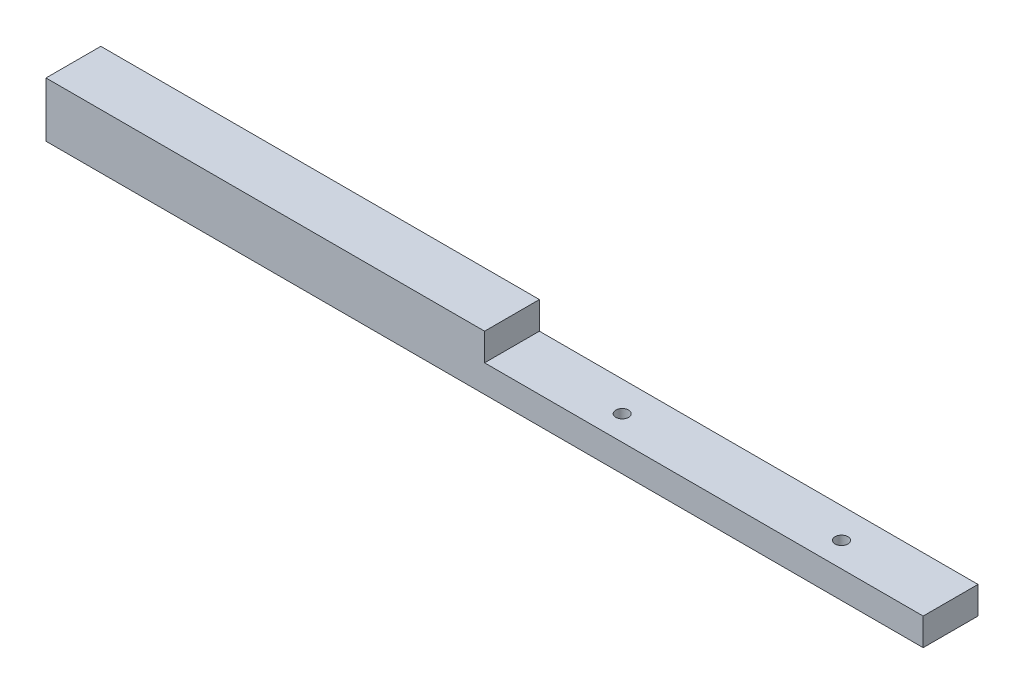
ISO-10303-21;
HEADER;
FILE_DESCRIPTION(('STEP AP214'),'2;1');
FILE_NAME('part.step','',(''),(''),'','','');
FILE_SCHEMA(('AUTOMOTIVE_DESIGN { 1 0 10303 214 1 1 1 1 }'));
ENDSEC;
DATA;
#1=APPLICATION_CONTEXT('core data for automotive mechanical design processes');
#2=APPLICATION_PROTOCOL_DEFINITION('international standard','automotive_design',2000,#1);
#3=PRODUCT_CONTEXT('',#1,'mechanical');
#4=PRODUCT('Part','Part','',(#3));
#5=PRODUCT_RELATED_PRODUCT_CATEGORY('part','',(#4));
#6=PRODUCT_DEFINITION_FORMATION('','',#4);
#7=PRODUCT_DEFINITION_CONTEXT('part definition',#1,'design');
#8=PRODUCT_DEFINITION('design','',#6,#7);
#9=PRODUCT_DEFINITION_SHAPE('','',#8);
#10=(LENGTH_UNIT() NAMED_UNIT(*) SI_UNIT(.MILLI.,.METRE.));
#11=(NAMED_UNIT(*) PLANE_ANGLE_UNIT() SI_UNIT($,.RADIAN.));
#12=(NAMED_UNIT(*) SI_UNIT($,.STERADIAN.) SOLID_ANGLE_UNIT());
#13=UNCERTAINTY_MEASURE_WITH_UNIT(LENGTH_MEASURE(1.E-05),#10,'distance_accuracy_value','');
#14=(GEOMETRIC_REPRESENTATION_CONTEXT(3) GLOBAL_UNCERTAINTY_ASSIGNED_CONTEXT((#13)) GLOBAL_UNIT_ASSIGNED_CONTEXT((#10,
#11,#12)) REPRESENTATION_CONTEXT('',''));
#15=CARTESIAN_POINT('',(0.,0.,0.));
#16=DIRECTION('',(0.,0.,1.));
#17=DIRECTION('',(1.,0.,0.));
#18=AXIS2_PLACEMENT_3D('',#15,#16,#17);
#19=CARTESIAN_POINT('',(195.886266753297,-328.191488077078,30.6295855642618));
#20=DIRECTION('',(0.,1.,0.));
#21=DIRECTION('',(0.,0.,1.));
#22=AXIS2_PLACEMENT_3D('',#19,#20,#21);
#23=CYLINDRICAL_SURFACE('',#22,1.75000000000001);
#24=CARTESIAN_POINT('',(195.886266753297,92.5,30.6295855642618));
#25=DIRECTION('',(0.,-1.,0.));
#26=DIRECTION('',(0.,0.,-1.));
#27=AXIS2_PLACEMENT_3D('',#24,#25,#26);
#28=CIRCLE('',#27,1.75000000000001);
#29=CARTESIAN_POINT('',(195.886266753297,92.5,28.8795855642618));
#30=VERTEX_POINT('',#29);
#31=EDGE_CURVE('E241',#30,#30,#28,.T.);
#32=ORIENTED_EDGE('',*,*,#31,.F.);
#33=EDGE_LOOP('',(#32));
#34=FACE_BOUND('',#33,.T.);
#35=CARTESIAN_POINT('',(195.886266753297,88.,30.6295855642618));
#36=DIRECTION('',(0.,-1.,0.));
#37=DIRECTION('',(0.,0.,-1.));
#38=AXIS2_PLACEMENT_3D('',#35,#36,#37);
#39=CIRCLE('',#38,1.75000000000001);
#40=CARTESIAN_POINT('',(195.886266753297,88.,28.8795855642618));
#41=VERTEX_POINT('',#40);
#42=EDGE_CURVE('E43',#41,#41,#39,.F.);
#43=ORIENTED_EDGE('',*,*,#42,.F.);
#44=EDGE_LOOP('',(#43));
#45=FACE_BOUND('',#44,.T.);
#46=ADVANCED_FACE('F39',(#34,#45),#23,.F.);
#47=CARTESIAN_POINT('',(135.886266753297,-328.191488077078,30.6295855642618));
#48=DIRECTION('',(0.,1.,0.));
#49=DIRECTION('',(0.,0.,1.));
#50=AXIS2_PLACEMENT_3D('',#47,#48,#49);
#51=CYLINDRICAL_SURFACE('',#50,1.75000000000001);
#52=CARTESIAN_POINT('',(135.886266753297,92.5,30.6295855642618));
#53=DIRECTION('',(0.,-1.,0.));
#54=DIRECTION('',(0.,0.,-1.));
#55=AXIS2_PLACEMENT_3D('',#52,#53,#54);
#56=CIRCLE('',#55,1.75000000000001);
#57=CARTESIAN_POINT('',(135.886266753297,92.5,28.8795855642618));
#58=VERTEX_POINT('',#57);
#59=EDGE_CURVE('E310',#58,#58,#56,.T.);
#60=ORIENTED_EDGE('',*,*,#59,.F.);
#61=EDGE_LOOP('',(#60));
#62=FACE_BOUND('',#61,.T.);
#63=CARTESIAN_POINT('',(135.886266753297,88.,30.6295855642618));
#64=DIRECTION('',(0.,-1.,0.));
#65=DIRECTION('',(0.,0.,-1.));
#66=AXIS2_PLACEMENT_3D('',#63,#64,#65);
#67=CIRCLE('',#66,1.75000000000001);
#68=CARTESIAN_POINT('',(135.886266753297,88.,28.8795855642618));
#69=VERTEX_POINT('',#68);
#70=EDGE_CURVE('E295',#69,#69,#67,.F.);
#71=ORIENTED_EDGE('',*,*,#70,.F.);
#72=EDGE_LOOP('',(#71));
#73=FACE_BOUND('',#72,.T.);
#74=ADVANCED_FACE('F382',(#62,#73),#51,.F.);
#75=CARTESIAN_POINT('',(225.,92.5,22.39));
#76=DIRECTION('',(-1.,0.,0.));
#77=DIRECTION('',(0.,0.,1.));
#78=AXIS2_PLACEMENT_3D('',#75,#76,#77);
#79=PLANE('',#78);
#80=DIRECTION('',(0.,0.,1.));
#81=VECTOR('',#80,1.);
#82=CARTESIAN_POINT('',(225.,92.5,22.39));
#83=LINE('',#82,#81);
#84=CARTESIAN_POINT('',(225.,92.5,22.4));
#85=VERTEX_POINT('',#84);
#86=CARTESIAN_POINT('',(225.,92.5,37.4));
#87=VERTEX_POINT('',#86);
#88=EDGE_CURVE('E11',#85,#87,#83,.T.);
#89=ORIENTED_EDGE('',*,*,#88,.T.);
#90=DIRECTION('',(0.,1.,0.));
#91=VECTOR('',#90,1.);
#92=CARTESIAN_POINT('',(225.,85.,37.4));
#93=LINE('',#92,#91);
#94=CARTESIAN_POINT('',(225.,85.,37.4));
#95=VERTEX_POINT('',#94);
#96=EDGE_CURVE('E360',#95,#87,#93,.T.);
#97=ORIENTED_EDGE('',*,*,#96,.F.);
#98=DIRECTION('',(0.,0.,1.));
#99=VECTOR('',#98,1.);
#100=CARTESIAN_POINT('',(225.,85.,22.4));
#101=LINE('',#100,#99);
#102=CARTESIAN_POINT('',(225.,85.,22.4));
#103=VERTEX_POINT('',#102);
#104=EDGE_CURVE('E357',#103,#95,#101,.T.);
#105=ORIENTED_EDGE('',*,*,#104,.F.);
#106=DIRECTION('',(0.,-1.,0.));
#107=VECTOR('',#106,1.);
#108=CARTESIAN_POINT('',(225.,85.,22.4));
#109=LINE('',#108,#107);
#110=EDGE_CURVE('E328',#85,#103,#109,.T.);
#111=ORIENTED_EDGE('',*,*,#110,.F.);
#112=EDGE_LOOP('',(#89,#97,#105,#111));
#113=FACE_BOUND('',#112,.T.);
#114=ADVANCED_FACE('F384',(#113),#79,.F.);
#115=CARTESIAN_POINT('',(105.,92.5,22.39));
#116=DIRECTION('',(0.,-1.,0.));
#117=DIRECTION('',(0.,0.,-1.));
#118=AXIS2_PLACEMENT_3D('',#115,#116,#117);
#119=PLANE('',#118);
#120=ORIENTED_EDGE('',*,*,#31,.T.);
#121=EDGE_LOOP('',(#120));
#122=FACE_BOUND('',#121,.T.);
#123=ORIENTED_EDGE('',*,*,#59,.T.);
#124=EDGE_LOOP('',(#123));
#125=FACE_BOUND('',#124,.T.);
#126=DIRECTION('',(0.,0.,1.));
#127=VECTOR('',#126,1.);
#128=CARTESIAN_POINT('',(105.,92.5,22.39));
#129=LINE('',#128,#127);
#130=CARTESIAN_POINT('',(105.,92.5,22.4));
#131=VERTEX_POINT('',#130);
#132=CARTESIAN_POINT('',(105.,92.5,37.4));
#133=VERTEX_POINT('',#132);
#134=EDGE_CURVE('E49',#131,#133,#129,.T.);
#135=ORIENTED_EDGE('',*,*,#134,.T.);
#136=DIRECTION('',(-1.,0.,0.));
#137=VECTOR('',#136,1.);
#138=CARTESIAN_POINT('',(-36.2132034355964,92.5,37.4));
#139=LINE('',#138,#137);
#140=EDGE_CURVE('E363',#87,#133,#139,.T.);
#141=ORIENTED_EDGE('',*,*,#140,.F.);
#142=ORIENTED_EDGE('',*,*,#88,.F.);
#143=DIRECTION('',(1.,0.,0.));
#144=VECTOR('',#143,1.);
#145=CARTESIAN_POINT('',(-36.2132034355964,92.5,22.4));
#146=LINE('',#145,#144);
#147=EDGE_CURVE('E349',#131,#85,#146,.T.);
#148=ORIENTED_EDGE('',*,*,#147,.F.);
#149=EDGE_LOOP('',(#135,#141,#142,#148));
#150=FACE_BOUND('',#149,.T.);
#151=ADVANCED_FACE('F391',(#122,#125,#150),#119,.F.);
#152=CARTESIAN_POINT('',(105.,100.,22.39));
#153=DIRECTION('',(-1.,0.,0.));
#154=DIRECTION('',(0.,0.,1.));
#155=AXIS2_PLACEMENT_3D('',#152,#153,#154);
#156=PLANE('',#155);
#157=DIRECTION('',(0.,0.,-1.));
#158=VECTOR('',#157,1.);
#159=CARTESIAN_POINT('',(105.,100.,22.4));
#160=LINE('',#159,#158);
#161=CARTESIAN_POINT('',(105.,100.,37.4));
#162=VERTEX_POINT('',#161);
#163=CARTESIAN_POINT('',(105.,100.,22.4));
#164=VERTEX_POINT('',#163);
#165=EDGE_CURVE('E369',#162,#164,#160,.T.);
#166=ORIENTED_EDGE('',*,*,#165,.F.);
#167=DIRECTION('',(0.,1.,0.));
#168=VECTOR('',#167,1.);
#169=CARTESIAN_POINT('',(105.,85.,37.4));
#170=LINE('',#169,#168);
#171=EDGE_CURVE('E366',#133,#162,#170,.T.);
#172=ORIENTED_EDGE('',*,*,#171,.F.);
#173=ORIENTED_EDGE('',*,*,#134,.F.);
#174=DIRECTION('',(0.,-1.,0.));
#175=VECTOR('',#174,1.);
#176=CARTESIAN_POINT('',(105.,85.,22.4));
#177=LINE('',#176,#175);
#178=EDGE_CURVE('E353',#164,#131,#177,.T.);
#179=ORIENTED_EDGE('',*,*,#178,.F.);
#180=EDGE_LOOP('',(#166,#172,#173,#179));
#181=FACE_BOUND('',#180,.T.);
#182=ADVANCED_FACE('F41',(#181),#156,.F.);
#183=CARTESIAN_POINT('',(-36.2132034355964,85.,37.4));
#184=DIRECTION('',(0.,0.,-1.));
#185=DIRECTION('',(-1.,0.,0.));
#186=AXIS2_PLACEMENT_3D('',#183,#184,#185);
#187=PLANE('',#186);
#188=ORIENTED_EDGE('',*,*,#140,.T.);
#189=ORIENTED_EDGE('',*,*,#171,.T.);
#190=DIRECTION('',(1.,0.,0.));
#191=VECTOR('',#190,1.);
#192=CARTESIAN_POINT('',(-36.2132034355964,100.,37.4));
#193=LINE('',#192,#191);
#194=CARTESIAN_POINT('',(-15.,100.,37.4));
#195=VERTEX_POINT('',#194);
#196=EDGE_CURVE('E332',#195,#162,#193,.T.);
#197=ORIENTED_EDGE('',*,*,#196,.F.);
#198=DIRECTION('',(0.,-1.,0.));
#199=VECTOR('',#198,1.);
#200=CARTESIAN_POINT('',(-15.,85.,37.4));
#201=LINE('',#200,#199);
#202=CARTESIAN_POINT('',(-15.,85.,37.4));
#203=VERTEX_POINT('',#202);
#204=EDGE_CURVE('E315',#195,#203,#201,.T.);
#205=ORIENTED_EDGE('',*,*,#204,.T.);
#206=DIRECTION('',(1.,0.,0.));
#207=VECTOR('',#206,1.);
#208=CARTESIAN_POINT('',(-36.2132034355964,85.,37.4));
#209=LINE('',#208,#207);
#210=EDGE_CURVE('E336',#203,#95,#209,.T.);
#211=ORIENTED_EDGE('',*,*,#210,.T.);
#212=ORIENTED_EDGE('',*,*,#96,.T.);
#213=EDGE_LOOP('',(#188,#189,#197,#205,#211,#212));
#214=FACE_BOUND('',#213,.T.);
#215=ADVANCED_FACE('F405',(#214),#187,.F.);
#216=CARTESIAN_POINT('',(-15.,85.,-158.613203435596));
#217=DIRECTION('',(1.,0.,0.));
#218=DIRECTION('',(0.,0.,-1.));
#219=AXIS2_PLACEMENT_3D('',#216,#217,#218);
#220=PLANE('',#219);
#221=DIRECTION('',(0.,0.,-1.));
#222=VECTOR('',#221,1.);
#223=CARTESIAN_POINT('',(-15.,85.,22.4));
#224=LINE('',#223,#222);
#225=CARTESIAN_POINT('',(-15.,85.,22.4));
#226=VERTEX_POINT('',#225);
#227=EDGE_CURVE('E319',#203,#226,#224,.T.);
#228=ORIENTED_EDGE('',*,*,#227,.F.);
#229=ORIENTED_EDGE('',*,*,#204,.F.);
#230=DIRECTION('',(0.,0.,1.));
#231=VECTOR('',#230,1.);
#232=CARTESIAN_POINT('',(-15.,100.,22.4));
#233=LINE('',#232,#231);
#234=CARTESIAN_POINT('',(-15.,100.,22.4));
#235=VERTEX_POINT('',#234);
#236=EDGE_CURVE('E320',#235,#195,#233,.T.);
#237=ORIENTED_EDGE('',*,*,#236,.F.);
#238=DIRECTION('',(0.,1.,0.));
#239=VECTOR('',#238,1.);
#240=CARTESIAN_POINT('',(-15.,85.,22.4));
#241=LINE('',#240,#239);
#242=EDGE_CURVE('E324',#226,#235,#241,.T.);
#243=ORIENTED_EDGE('',*,*,#242,.F.);
#244=EDGE_LOOP('',(#228,#229,#237,#243));
#245=FACE_BOUND('',#244,.T.);
#246=ADVANCED_FACE('F401',(#245),#220,.F.);
#247=CARTESIAN_POINT('',(-36.2132034355964,85.,22.4));
#248=DIRECTION('',(0.,1.,0.));
#249=DIRECTION('',(0.,0.,1.));
#250=AXIS2_PLACEMENT_3D('',#247,#248,#249);
#251=PLANE('',#250);
#252=DIRECTION('',(0.866025403784439,0.,0.499999999999999));
#253=VECTOR('',#252,1.);
#254=CARTESIAN_POINT('',(270.117714950395,85.,70.0230305480528));
#255=LINE('',#254,#253);
#256=CARTESIAN_POINT('',(195.886266753297,85.,27.1654839491226));
#257=VERTEX_POINT('',#256);
#258=CARTESIAN_POINT('',(198.886266753297,85.,28.8975347566915));
#259=VERTEX_POINT('',#258);
#260=EDGE_CURVE('E213',#257,#259,#255,.T.);
#261=ORIENTED_EDGE('',*,*,#260,.F.);
#262=DIRECTION('',(0.866025403784438,0.,-0.500000000000002));
#263=VECTOR('',#262,1.);
#264=CARTESIAN_POINT('',(399.645223579648,85.,-90.4748046243693));
#265=LINE('',#264,#263);
#266=CARTESIAN_POINT('',(192.886266753297,85.,28.8975347566915));
#267=VERTEX_POINT('',#266);
#268=EDGE_CURVE('E57',#267,#257,#265,.T.);
#269=ORIENTED_EDGE('',*,*,#268,.F.);
#270=DIRECTION('',(0.,0.,-1.));
#271=VECTOR('',#270,1.);
#272=CARTESIAN_POINT('',(192.886266753297,85.,-122.4));
#273=LINE('',#272,#271);
#274=CARTESIAN_POINT('',(192.886266753297,85.,32.3616363718292));
#275=VERTEX_POINT('',#274);
#276=EDGE_CURVE('E192',#275,#267,#273,.T.);
#277=ORIENTED_EDGE('',*,*,#276,.F.);
#278=DIRECTION('',(-0.866025403784439,0.,-0.5));
#279=VECTOR('',#278,1.);
#280=CARTESIAN_POINT('',(267.117714950395,85.,75.2191829707593));
#281=LINE('',#280,#279);
#282=CARTESIAN_POINT('',(195.886266753297,85.,34.0936871793981));
#283=VERTEX_POINT('',#282);
#284=EDGE_CURVE('E197',#283,#275,#281,.T.);
#285=ORIENTED_EDGE('',*,*,#284,.F.);
#286=DIRECTION('',(-0.866025403784439,0.,0.5));
#287=VECTOR('',#286,1.);
#288=CARTESIAN_POINT('',(402.645223579648,85.,-85.2786522016621));
#289=LINE('',#288,#287);
#290=CARTESIAN_POINT('',(198.886266753296,85.,32.3616363718296));
#291=VERTEX_POINT('',#290);
#292=EDGE_CURVE('E220',#291,#283,#289,.T.);
#293=ORIENTED_EDGE('',*,*,#292,.F.);
#294=DIRECTION('',(0.,0.,1.));
#295=VECTOR('',#294,1.);
#296=CARTESIAN_POINT('',(198.886266753297,85.,-122.4));
#297=LINE('',#296,#295);
#298=EDGE_CURVE('E216',#259,#291,#297,.T.);
#299=ORIENTED_EDGE('',*,*,#298,.F.);
#300=EDGE_LOOP('',(#261,#269,#277,#285,#293,#299));
#301=FACE_BOUND('',#300,.T.);
#302=DIRECTION('',(0.866025403784439,0.,0.499999999999999));
#303=VECTOR('',#302,1.);
#304=CARTESIAN_POINT('',(255.117714950395,85.,96.0037926615859));
#305=LINE('',#304,#303);
#306=CARTESIAN_POINT('',(135.886266753297,85.,27.1654839491225));
#307=VERTEX_POINT('',#306);
#308=CARTESIAN_POINT('',(138.886266753297,85.,28.8975347566914));
#309=VERTEX_POINT('',#308);
#310=EDGE_CURVE('E273',#307,#309,#305,.T.);
#311=ORIENTED_EDGE('',*,*,#310,.F.);
#312=DIRECTION('',(0.866025403784438,0.,-0.500000000000002));
#313=VECTOR('',#312,1.);
#314=CARTESIAN_POINT('',(384.645223579648,85.,-116.455566737903));
#315=LINE('',#314,#313);
#316=CARTESIAN_POINT('',(132.886266753297,85.,28.8975347566915));
#317=VERTEX_POINT('',#316);
#318=EDGE_CURVE('E65',#317,#307,#315,.T.);
#319=ORIENTED_EDGE('',*,*,#318,.F.);
#320=DIRECTION('',(0.,0.,-1.));
#321=VECTOR('',#320,1.);
#322=CARTESIAN_POINT('',(132.886266753297,85.,-122.4));
#323=LINE('',#322,#321);
#324=CARTESIAN_POINT('',(132.886266753297,85.,32.3616363718292));
#325=VERTEX_POINT('',#324);
#326=EDGE_CURVE('E250',#325,#317,#323,.T.);
#327=ORIENTED_EDGE('',*,*,#326,.F.);
#328=DIRECTION('',(-0.866025403784439,0.,-0.5));
#329=VECTOR('',#328,1.);
#330=CARTESIAN_POINT('',(252.117714950395,85.,101.199945084292));
#331=LINE('',#330,#329);
#332=CARTESIAN_POINT('',(135.886266753297,85.,34.0936871793981));
#333=VERTEX_POINT('',#332);
#334=EDGE_CURVE('E285',#333,#325,#331,.T.);
#335=ORIENTED_EDGE('',*,*,#334,.F.);
#336=DIRECTION('',(-0.866025403784439,0.,0.5));
#337=VECTOR('',#336,1.);
#338=CARTESIAN_POINT('',(387.645223579648,85.,-111.259414315195));
#339=LINE('',#338,#337);
#340=CARTESIAN_POINT('',(138.886266753296,85.,32.3616363718296));
#341=VERTEX_POINT('',#340);
#342=EDGE_CURVE('E281',#341,#333,#339,.T.);
#343=ORIENTED_EDGE('',*,*,#342,.F.);
#344=DIRECTION('',(0.,0.,1.));
#345=VECTOR('',#344,1.);
#346=CARTESIAN_POINT('',(138.886266753297,85.,-122.4));
#347=LINE('',#346,#345);
#348=EDGE_CURVE('E277',#309,#341,#347,.T.);
#349=ORIENTED_EDGE('',*,*,#348,.F.);
#350=EDGE_LOOP('',(#311,#319,#327,#335,#343,#349));
#351=FACE_BOUND('',#350,.T.);
#352=DIRECTION('',(1.,0.,0.));
#353=VECTOR('',#352,1.);
#354=CARTESIAN_POINT('',(-36.2132034355964,85.,22.4));
#355=LINE('',#354,#353);
#356=EDGE_CURVE('E340',#226,#103,#355,.T.);
#357=ORIENTED_EDGE('',*,*,#356,.T.);
#358=ORIENTED_EDGE('',*,*,#104,.T.);
#359=ORIENTED_EDGE('',*,*,#210,.F.);
#360=ORIENTED_EDGE('',*,*,#227,.T.);
#361=EDGE_LOOP('',(#357,#358,#359,#360));
#362=FACE_BOUND('',#361,.T.);
#363=ADVANCED_FACE('F404',(#301,#351,#362),#251,.F.);
#364=CARTESIAN_POINT('',(-36.2132034355964,100.,22.4));
#365=DIRECTION('',(0.,-1.,0.));
#366=DIRECTION('',(0.,0.,-1.));
#367=AXIS2_PLACEMENT_3D('',#364,#365,#366);
#368=PLANE('',#367);
#369=ORIENTED_EDGE('',*,*,#196,.T.);
#370=ORIENTED_EDGE('',*,*,#165,.T.);
#371=DIRECTION('',(1.,0.,0.));
#372=VECTOR('',#371,1.);
#373=CARTESIAN_POINT('',(-36.2132034355964,100.,22.4));
#374=LINE('',#373,#372);
#375=EDGE_CURVE('E314',#235,#164,#374,.T.);
#376=ORIENTED_EDGE('',*,*,#375,.F.);
#377=ORIENTED_EDGE('',*,*,#236,.T.);
#378=EDGE_LOOP('',(#369,#370,#376,#377));
#379=FACE_BOUND('',#378,.T.);
#380=ADVANCED_FACE('F407',(#379),#368,.F.);
#381=CARTESIAN_POINT('',(-36.2132034355964,85.,22.4));
#382=DIRECTION('',(0.,0.,1.));
#383=DIRECTION('',(1.,0.,0.));
#384=AXIS2_PLACEMENT_3D('',#381,#382,#383);
#385=PLANE('',#384);
#386=ORIENTED_EDGE('',*,*,#375,.T.);
#387=ORIENTED_EDGE('',*,*,#178,.T.);
#388=ORIENTED_EDGE('',*,*,#147,.T.);
#389=ORIENTED_EDGE('',*,*,#110,.T.);
#390=ORIENTED_EDGE('',*,*,#356,.F.);
#391=ORIENTED_EDGE('',*,*,#242,.T.);
#392=EDGE_LOOP('',(#386,#387,#388,#389,#390,#391));
#393=FACE_BOUND('',#392,.T.);
#394=ADVANCED_FACE('F410',(#393),#385,.F.);
#395=CARTESIAN_POINT('',(0.,88.,0.));
#396=DIRECTION('',(0.,-1.,0.));
#397=DIRECTION('',(0.,0.,-1.));
#398=AXIS2_PLACEMENT_3D('',#395,#396,#397);
#399=PLANE('',#398);
#400=DIRECTION('',(0.866025403784438,0.,-0.500000000000002));
#401=VECTOR('',#400,1.);
#402=CARTESIAN_POINT('',(384.645223579648,88.,-116.455566737903));
#403=LINE('',#402,#401);
#404=CARTESIAN_POINT('',(132.886266753297,88.,28.8975347566915));
#405=VERTEX_POINT('',#404);
#406=CARTESIAN_POINT('',(135.886266753297,88.,27.1654839491226));
#407=VERTEX_POINT('',#406);
#408=EDGE_CURVE('E245',#405,#407,#403,.T.);
#409=ORIENTED_EDGE('',*,*,#408,.T.);
#410=DIRECTION('',(0.866025403784439,0.,0.499999999999999));
#411=VECTOR('',#410,1.);
#412=CARTESIAN_POINT('',(255.117714950395,88.,96.0037926615858));
#413=LINE('',#412,#411);
#414=CARTESIAN_POINT('',(138.886266753297,88.,28.8975347566914));
#415=VERTEX_POINT('',#414);
#416=EDGE_CURVE('E249',#407,#415,#413,.T.);
#417=ORIENTED_EDGE('',*,*,#416,.T.);
#418=DIRECTION('',(0.,0.,1.));
#419=VECTOR('',#418,1.);
#420=CARTESIAN_POINT('',(138.886266753297,88.,-122.4));
#421=LINE('',#420,#419);
#422=CARTESIAN_POINT('',(138.886266753296,88.,32.3616363718296));
#423=VERTEX_POINT('',#422);
#424=EDGE_CURVE('E254',#415,#423,#421,.T.);
#425=ORIENTED_EDGE('',*,*,#424,.T.);
#426=DIRECTION('',(-0.866025403784439,0.,0.5));
#427=VECTOR('',#426,1.);
#428=CARTESIAN_POINT('',(387.645223579648,88.,-111.259414315195));
#429=LINE('',#428,#427);
#430=CARTESIAN_POINT('',(135.886266753297,88.,34.093687179398));
#431=VERTEX_POINT('',#430);
#432=EDGE_CURVE('E258',#423,#431,#429,.T.);
#433=ORIENTED_EDGE('',*,*,#432,.T.);
#434=DIRECTION('',(-0.866025403784439,0.,-0.5));
#435=VECTOR('',#434,1.);
#436=CARTESIAN_POINT('',(252.117714950395,88.,101.199945084292));
#437=LINE('',#436,#435);
#438=CARTESIAN_POINT('',(132.886266753297,88.,32.3616363718292));
#439=VERTEX_POINT('',#438);
#440=EDGE_CURVE('E262',#431,#439,#437,.T.);
#441=ORIENTED_EDGE('',*,*,#440,.T.);
#442=DIRECTION('',(0.,0.,-1.));
#443=VECTOR('',#442,1.);
#444=CARTESIAN_POINT('',(132.886266753297,88.,-122.4));
#445=LINE('',#444,#443);
#446=EDGE_CURVE('E266',#439,#405,#445,.T.);
#447=ORIENTED_EDGE('',*,*,#446,.T.);
#448=EDGE_LOOP('',(#409,#417,#425,#433,#441,#447));
#449=FACE_BOUND('',#448,.T.);
#450=ORIENTED_EDGE('',*,*,#70,.T.);
#451=EDGE_LOOP('',(#450));
#452=FACE_BOUND('',#451,.T.);
#453=ADVANCED_FACE('F380',(#449,#452),#399,.T.);
#454=CARTESIAN_POINT('',(384.645223579648,88.,-116.455566737903));
#455=DIRECTION('',(-0.500000000000002,0.,-0.866025403784437));
#456=DIRECTION('',(-0.866025403784438,0.,0.500000000000002));
#457=AXIS2_PLACEMENT_3D('',#454,#455,#456);
#458=PLANE('',#457);
#459=ORIENTED_EDGE('',*,*,#318,.T.);
#460=DIRECTION('',(0.,-1.,0.));
#461=VECTOR('',#460,1.);
#462=CARTESIAN_POINT('',(135.886266753297,88.,27.1654839491226));
#463=LINE('',#462,#461);
#464=EDGE_CURVE('E270',#407,#307,#463,.T.);
#465=ORIENTED_EDGE('',*,*,#464,.F.);
#466=ORIENTED_EDGE('',*,*,#408,.F.);
#467=DIRECTION('',(0.,-1.,0.));
#468=VECTOR('',#467,1.);
#469=CARTESIAN_POINT('',(132.886266753297,88.,28.8975347566915));
#470=LINE('',#469,#468);
#471=EDGE_CURVE('E292',#405,#317,#470,.T.);
#472=ORIENTED_EDGE('',*,*,#471,.T.);
#473=EDGE_LOOP('',(#459,#465,#466,#472));
#474=FACE_BOUND('',#473,.T.);
#475=ADVANCED_FACE('F399',(#474),#458,.F.);
#476=CARTESIAN_POINT('',(132.886266753297,88.,-122.4));
#477=DIRECTION('',(-1.,0.,0.));
#478=DIRECTION('',(0.,0.,1.));
#479=AXIS2_PLACEMENT_3D('',#476,#477,#478);
#480=PLANE('',#479);
#481=ORIENTED_EDGE('',*,*,#326,.T.);
#482=ORIENTED_EDGE('',*,*,#471,.F.);
#483=ORIENTED_EDGE('',*,*,#446,.F.);
#484=DIRECTION('',(0.,-1.,0.));
#485=VECTOR('',#484,1.);
#486=CARTESIAN_POINT('',(132.886266753297,88.,32.3616363718292));
#487=LINE('',#486,#485);
#488=EDGE_CURVE('E296',#439,#325,#487,.T.);
#489=ORIENTED_EDGE('',*,*,#488,.T.);
#490=EDGE_LOOP('',(#481,#482,#483,#489));
#491=FACE_BOUND('',#490,.T.);
#492=ADVANCED_FACE('F508',(#491),#480,.F.);
#493=CARTESIAN_POINT('',(252.117714950395,88.,101.199945084292));
#494=DIRECTION('',(-0.5,0.,0.866025403784439));
#495=DIRECTION('',(0.866025403784439,0.,0.5));
#496=AXIS2_PLACEMENT_3D('',#493,#494,#495);
#497=PLANE('',#496);
#498=ORIENTED_EDGE('',*,*,#334,.T.);
#499=ORIENTED_EDGE('',*,*,#488,.F.);
#500=ORIENTED_EDGE('',*,*,#440,.F.);
#501=DIRECTION('',(0.,-1.,0.));
#502=VECTOR('',#501,1.);
#503=CARTESIAN_POINT('',(135.886266753297,88.,34.093687179398));
#504=LINE('',#503,#502);
#505=EDGE_CURVE('E299',#431,#333,#504,.T.);
#506=ORIENTED_EDGE('',*,*,#505,.T.);
#507=EDGE_LOOP('',(#498,#499,#500,#506));
#508=FACE_BOUND('',#507,.T.);
#509=ADVANCED_FACE('F511',(#508),#497,.F.);
#510=CARTESIAN_POINT('',(387.645223579648,88.,-111.259414315195));
#511=DIRECTION('',(0.5,0.,0.866025403784439));
#512=DIRECTION('',(0.866025403784439,0.,-0.5));
#513=AXIS2_PLACEMENT_3D('',#510,#511,#512);
#514=PLANE('',#513);
#515=ORIENTED_EDGE('',*,*,#342,.T.);
#516=ORIENTED_EDGE('',*,*,#505,.F.);
#517=ORIENTED_EDGE('',*,*,#432,.F.);
#518=DIRECTION('',(0.,-1.,0.));
#519=VECTOR('',#518,1.);
#520=CARTESIAN_POINT('',(138.886266753296,88.,32.3616363718296));
#521=LINE('',#520,#519);
#522=EDGE_CURVE('E302',#423,#341,#521,.T.);
#523=ORIENTED_EDGE('',*,*,#522,.T.);
#524=EDGE_LOOP('',(#515,#516,#517,#523));
#525=FACE_BOUND('',#524,.T.);
#526=ADVANCED_FACE('F515',(#525),#514,.F.);
#527=CARTESIAN_POINT('',(138.886266753297,88.,-122.4));
#528=DIRECTION('',(1.,0.,0.));
#529=DIRECTION('',(0.,0.,-1.));
#530=AXIS2_PLACEMENT_3D('',#527,#528,#529);
#531=PLANE('',#530);
#532=ORIENTED_EDGE('',*,*,#348,.T.);
#533=ORIENTED_EDGE('',*,*,#522,.F.);
#534=ORIENTED_EDGE('',*,*,#424,.F.);
#535=DIRECTION('',(0.,-1.,0.));
#536=VECTOR('',#535,1.);
#537=CARTESIAN_POINT('',(138.886266753297,88.,28.8975347566914));
#538=LINE('',#537,#536);
#539=EDGE_CURVE('E305',#415,#309,#538,.T.);
#540=ORIENTED_EDGE('',*,*,#539,.T.);
#541=EDGE_LOOP('',(#532,#533,#534,#540));
#542=FACE_BOUND('',#541,.T.);
#543=ADVANCED_FACE('F485',(#542),#531,.F.);
#544=CARTESIAN_POINT('',(255.117714950395,88.,96.0037926615858));
#545=DIRECTION('',(0.499999999999999,0.,-0.866025403784439));
#546=DIRECTION('',(-0.866025403784439,0.,-0.499999999999999));
#547=AXIS2_PLACEMENT_3D('',#544,#545,#546);
#548=PLANE('',#547);
#549=ORIENTED_EDGE('',*,*,#310,.T.);
#550=ORIENTED_EDGE('',*,*,#539,.F.);
#551=ORIENTED_EDGE('',*,*,#416,.F.);
#552=ORIENTED_EDGE('',*,*,#464,.T.);
#553=EDGE_LOOP('',(#549,#550,#551,#552));
#554=FACE_BOUND('',#553,.T.);
#555=ADVANCED_FACE('F477',(#554),#548,.F.);
#556=CARTESIAN_POINT('',(0.,88.,0.));
#557=DIRECTION('',(0.,-1.,0.));
#558=DIRECTION('',(0.,0.,-1.));
#559=AXIS2_PLACEMENT_3D('',#556,#557,#558);
#560=PLANE('',#559);
#561=DIRECTION('',(0.866025403784438,0.,-0.500000000000002));
#562=VECTOR('',#561,1.);
#563=CARTESIAN_POINT('',(399.645223579648,88.,-90.4748046243693));
#564=LINE('',#563,#562);
#565=CARTESIAN_POINT('',(192.886266753297,88.,28.8975347566915));
#566=VERTEX_POINT('',#565);
#567=CARTESIAN_POINT('',(195.886266753297,88.,27.1654839491226));
#568=VERTEX_POINT('',#567);
#569=EDGE_CURVE('E169',#566,#568,#564,.T.);
#570=ORIENTED_EDGE('',*,*,#569,.T.);
#571=DIRECTION('',(0.866025403784439,0.,0.499999999999999));
#572=VECTOR('',#571,1.);
#573=CARTESIAN_POINT('',(270.117714950395,88.,70.0230305480528));
#574=LINE('',#573,#572);
#575=CARTESIAN_POINT('',(198.886266753297,88.,28.8975347566915));
#576=VERTEX_POINT('',#575);
#577=EDGE_CURVE('E179',#568,#576,#574,.T.);
#578=ORIENTED_EDGE('',*,*,#577,.T.);
#579=DIRECTION('',(0.,0.,1.));
#580=VECTOR('',#579,1.);
#581=CARTESIAN_POINT('',(198.886266753297,88.,-122.4));
#582=LINE('',#581,#580);
#583=CARTESIAN_POINT('',(198.886266753296,88.,32.3616363718296));
#584=VERTEX_POINT('',#583);
#585=EDGE_CURVE('E185',#576,#584,#582,.T.);
#586=ORIENTED_EDGE('',*,*,#585,.T.);
#587=DIRECTION('',(-0.866025403784439,0.,0.5));
#588=VECTOR('',#587,1.);
#589=CARTESIAN_POINT('',(402.645223579648,88.,-85.2786522016622));
#590=LINE('',#589,#588);
#591=CARTESIAN_POINT('',(195.886266753297,88.,34.0936871793981));
#592=VERTEX_POINT('',#591);
#593=EDGE_CURVE('E202',#584,#592,#590,.T.);
#594=ORIENTED_EDGE('',*,*,#593,.T.);
#595=DIRECTION('',(-0.866025403784439,0.,-0.5));
#596=VECTOR('',#595,1.);
#597=CARTESIAN_POINT('',(267.117714950395,88.,75.2191829707593));
#598=LINE('',#597,#596);
#599=CARTESIAN_POINT('',(192.886266753297,88.,32.3616363718292));
#600=VERTEX_POINT('',#599);
#601=EDGE_CURVE('E206',#592,#600,#598,.T.);
#602=ORIENTED_EDGE('',*,*,#601,.T.);
#603=DIRECTION('',(0.,0.,-1.));
#604=VECTOR('',#603,1.);
#605=CARTESIAN_POINT('',(192.886266753297,88.,-122.4));
#606=LINE('',#605,#604);
#607=EDGE_CURVE('E176',#600,#566,#606,.T.);
#608=ORIENTED_EDGE('',*,*,#607,.T.);
#609=EDGE_LOOP('',(#570,#578,#586,#594,#602,#608));
#610=FACE_BOUND('',#609,.T.);
#611=ORIENTED_EDGE('',*,*,#42,.T.);
#612=EDGE_LOOP('',(#611));
#613=FACE_BOUND('',#612,.T.);
#614=ADVANCED_FACE('F187',(#610,#613),#560,.T.);
#615=CARTESIAN_POINT('',(399.645223579648,88.,-90.4748046243693));
#616=DIRECTION('',(-0.500000000000002,0.,-0.866025403784437));
#617=DIRECTION('',(-0.866025403784438,0.,0.500000000000002));
#618=AXIS2_PLACEMENT_3D('',#615,#616,#617);
#619=PLANE('',#618);
#620=ORIENTED_EDGE('',*,*,#268,.T.);
#621=DIRECTION('',(0.,-1.,0.));
#622=VECTOR('',#621,1.);
#623=CARTESIAN_POINT('',(195.886266753297,88.,27.1654839491226));
#624=LINE('',#623,#622);
#625=EDGE_CURVE('E165',#568,#257,#624,.T.);
#626=ORIENTED_EDGE('',*,*,#625,.F.);
#627=ORIENTED_EDGE('',*,*,#569,.F.);
#628=DIRECTION('',(0.,-1.,0.));
#629=VECTOR('',#628,1.);
#630=CARTESIAN_POINT('',(192.886266753297,88.,28.8975347566915));
#631=LINE('',#630,#629);
#632=EDGE_CURVE('E227',#566,#267,#631,.T.);
#633=ORIENTED_EDGE('',*,*,#632,.T.);
#634=EDGE_LOOP('',(#620,#626,#627,#633));
#635=FACE_BOUND('',#634,.T.);
#636=ADVANCED_FACE('F167',(#635),#619,.F.);
#637=CARTESIAN_POINT('',(192.886266753297,88.,-122.4));
#638=DIRECTION('',(-1.,0.,0.));
#639=DIRECTION('',(0.,0.,1.));
#640=AXIS2_PLACEMENT_3D('',#637,#638,#639);
#641=PLANE('',#640);
#642=ORIENTED_EDGE('',*,*,#276,.T.);
#643=ORIENTED_EDGE('',*,*,#632,.F.);
#644=ORIENTED_EDGE('',*,*,#607,.F.);
#645=DIRECTION('',(0.,-1.,0.));
#646=VECTOR('',#645,1.);
#647=CARTESIAN_POINT('',(192.886266753297,88.,32.3616363718292));
#648=LINE('',#647,#646);
#649=EDGE_CURVE('E230',#600,#275,#648,.T.);
#650=ORIENTED_EDGE('',*,*,#649,.T.);
#651=EDGE_LOOP('',(#642,#643,#644,#650));
#652=FACE_BOUND('',#651,.T.);
#653=ADVANCED_FACE('F483',(#652),#641,.F.);
#654=CARTESIAN_POINT('',(267.117714950395,88.,75.2191829707593));
#655=DIRECTION('',(-0.5,0.,0.866025403784439));
#656=DIRECTION('',(0.866025403784439,0.,0.5));
#657=AXIS2_PLACEMENT_3D('',#654,#655,#656);
#658=PLANE('',#657);
#659=ORIENTED_EDGE('',*,*,#284,.T.);
#660=ORIENTED_EDGE('',*,*,#649,.F.);
#661=ORIENTED_EDGE('',*,*,#601,.F.);
#662=DIRECTION('',(0.,-1.,0.));
#663=VECTOR('',#662,1.);
#664=CARTESIAN_POINT('',(195.886266753297,88.,34.0936871793981));
#665=LINE('',#664,#663);
#666=EDGE_CURVE('E233',#592,#283,#665,.T.);
#667=ORIENTED_EDGE('',*,*,#666,.T.);
#668=EDGE_LOOP('',(#659,#660,#661,#667));
#669=FACE_BOUND('',#668,.T.);
#670=ADVANCED_FACE('F490',(#669),#658,.F.);
#671=CARTESIAN_POINT('',(402.645223579648,88.,-85.2786522016622));
#672=DIRECTION('',(0.5,0.,0.866025403784439));
#673=DIRECTION('',(0.866025403784439,0.,-0.5));
#674=AXIS2_PLACEMENT_3D('',#671,#672,#673);
#675=PLANE('',#674);
#676=ORIENTED_EDGE('',*,*,#292,.T.);
#677=ORIENTED_EDGE('',*,*,#666,.F.);
#678=ORIENTED_EDGE('',*,*,#593,.F.);
#679=DIRECTION('',(0.,-1.,0.));
#680=VECTOR('',#679,1.);
#681=CARTESIAN_POINT('',(198.886266753296,88.,32.3616363718296));
#682=LINE('',#681,#680);
#683=EDGE_CURVE('E236',#584,#291,#682,.T.);
#684=ORIENTED_EDGE('',*,*,#683,.T.);
#685=EDGE_LOOP('',(#676,#677,#678,#684));
#686=FACE_BOUND('',#685,.T.);
#687=ADVANCED_FACE('F494',(#686),#675,.F.);
#688=CARTESIAN_POINT('',(198.886266753297,88.,-122.4));
#689=DIRECTION('',(1.,0.,0.));
#690=DIRECTION('',(0.,0.,-1.));
#691=AXIS2_PLACEMENT_3D('',#688,#689,#690);
#692=PLANE('',#691);
#693=ORIENTED_EDGE('',*,*,#298,.T.);
#694=ORIENTED_EDGE('',*,*,#683,.F.);
#695=ORIENTED_EDGE('',*,*,#585,.F.);
#696=DIRECTION('',(0.,-1.,0.));
#697=VECTOR('',#696,1.);
#698=CARTESIAN_POINT('',(198.886266753297,88.,28.8975347566915));
#699=LINE('',#698,#697);
#700=EDGE_CURVE('E175',#576,#259,#699,.T.);
#701=ORIENTED_EDGE('',*,*,#700,.T.);
#702=EDGE_LOOP('',(#693,#694,#695,#701));
#703=FACE_BOUND('',#702,.T.);
#704=ADVANCED_FACE('F498',(#703),#692,.F.);
#705=CARTESIAN_POINT('',(270.117714950395,88.,70.0230305480528));
#706=DIRECTION('',(0.499999999999999,0.,-0.866025403784439));
#707=DIRECTION('',(-0.866025403784439,0.,-0.499999999999999));
#708=AXIS2_PLACEMENT_3D('',#705,#706,#707);
#709=PLANE('',#708);
#710=ORIENTED_EDGE('',*,*,#260,.T.);
#711=ORIENTED_EDGE('',*,*,#700,.F.);
#712=ORIENTED_EDGE('',*,*,#577,.F.);
#713=ORIENTED_EDGE('',*,*,#625,.T.);
#714=EDGE_LOOP('',(#710,#711,#712,#713));
#715=FACE_BOUND('',#714,.T.);
#716=ADVANCED_FACE('F180',(#715),#709,.F.);
#717=CLOSED_SHELL('',(#46,#74,#114,#151,#182,#215,#246,#363,#380,#394,#453,#475,#492,#509,#526,
#543,#555,#614,#636,#653,#670,#687,#704,#716));
#718=MANIFOLD_SOLID_BREP('B2',#717);
#719=ADVANCED_BREP_SHAPE_REPRESENTATION('',(#18,#718),#14);
#720=SHAPE_DEFINITION_REPRESENTATION(#9,#719);
ENDSEC;
END-ISO-10303-21;
